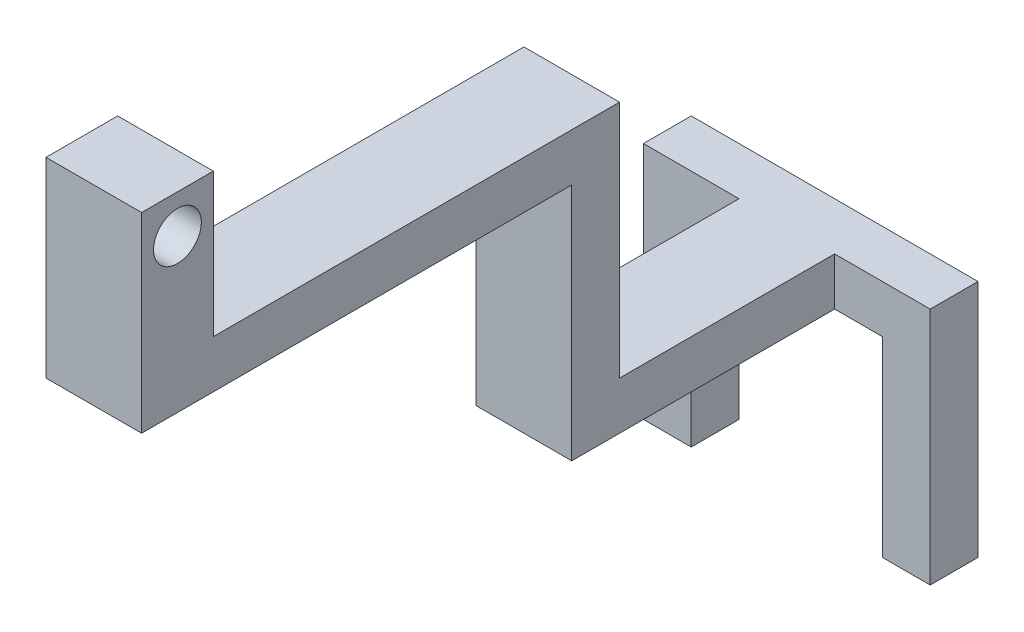
ISO-10303-21;
HEADER;
FILE_DESCRIPTION(('STEP AP214'),'2;1');
FILE_NAME('part.step','',(''),(''),'','','');
FILE_SCHEMA(('AUTOMOTIVE_DESIGN { 1 0 10303 214 1 1 1 1 }'));
ENDSEC;
DATA;
#1=APPLICATION_CONTEXT('core data for automotive mechanical design processes');
#2=APPLICATION_PROTOCOL_DEFINITION('international standard','automotive_design',2000,#1);
#3=PRODUCT_CONTEXT('',#1,'mechanical');
#4=PRODUCT('Part','Part','',(#3));
#5=PRODUCT_RELATED_PRODUCT_CATEGORY('part','',(#4));
#6=PRODUCT_DEFINITION_FORMATION('','',#4);
#7=PRODUCT_DEFINITION_CONTEXT('part definition',#1,'design');
#8=PRODUCT_DEFINITION('design','',#6,#7);
#9=PRODUCT_DEFINITION_SHAPE('','',#8);
#10=(LENGTH_UNIT() NAMED_UNIT(*) SI_UNIT(.MILLI.,.METRE.));
#11=(NAMED_UNIT(*) PLANE_ANGLE_UNIT() SI_UNIT($,.RADIAN.));
#12=(NAMED_UNIT(*) SI_UNIT($,.STERADIAN.) SOLID_ANGLE_UNIT());
#13=UNCERTAINTY_MEASURE_WITH_UNIT(LENGTH_MEASURE(1.E-05),#10,'distance_accuracy_value','');
#14=(GEOMETRIC_REPRESENTATION_CONTEXT(3) GLOBAL_UNCERTAINTY_ASSIGNED_CONTEXT((#13)) GLOBAL_UNIT_ASSIGNED_CONTEXT((#10,
#11,#12)) REPRESENTATION_CONTEXT('',''));
#15=CARTESIAN_POINT('',(0.,0.,0.));
#16=DIRECTION('',(0.,0.,1.));
#17=DIRECTION('',(1.,0.,0.));
#18=AXIS2_PLACEMENT_3D('',#15,#16,#17);
#19=CARTESIAN_POINT('',(0.,50.,0.));
#20=DIRECTION('',(0.,-1.,0.));
#21=DIRECTION('',(0.,0.,-1.));
#22=AXIS2_PLACEMENT_3D('',#19,#20,#21);
#23=PLANE('',#22);
#24=DIRECTION('',(-1.,0.,0.));
#25=VECTOR('',#24,1.);
#26=CARTESIAN_POINT('',(20.,50.,140.));
#27=LINE('',#26,#25);
#28=CARTESIAN_POINT('',(40.,50.,140.));
#29=VERTEX_POINT('',#28);
#30=CARTESIAN_POINT('',(20.,50.,140.));
#31=VERTEX_POINT('',#30);
#32=EDGE_CURVE('E54',#29,#31,#27,.T.);
#33=ORIENTED_EDGE('',*,*,#32,.F.);
#34=DIRECTION('',(0.,0.,-1.));
#35=VECTOR('',#34,1.);
#36=CARTESIAN_POINT('',(40.,50.,65.));
#37=LINE('',#36,#35);
#38=CARTESIAN_POINT('',(40.,50.,55.));
#39=VERTEX_POINT('',#38);
#40=EDGE_CURVE('E214',#29,#39,#37,.T.);
#41=ORIENTED_EDGE('',*,*,#40,.T.);
#42=DIRECTION('',(-1.,0.,0.));
#43=VECTOR('',#42,1.);
#44=CARTESIAN_POINT('',(20.,50.,55.));
#45=LINE('',#44,#43);
#46=CARTESIAN_POINT('',(20.,50.,55.));
#47=VERTEX_POINT('',#46);
#48=EDGE_CURVE('E216',#39,#47,#45,.T.);
#49=ORIENTED_EDGE('',*,*,#48,.T.);
#50=DIRECTION('',(0.,0.,1.));
#51=VECTOR('',#50,1.);
#52=CARTESIAN_POINT('',(20.,50.,65.));
#53=LINE('',#52,#51);
#54=EDGE_CURVE('E212',#47,#31,#53,.T.);
#55=ORIENTED_EDGE('',*,*,#54,.T.);
#56=EDGE_LOOP('',(#33,#41,#49,#55));
#57=FACE_BOUND('',#56,.T.);
#58=ADVANCED_FACE('F39',(#57),#23,.F.);
#59=CARTESIAN_POINT('',(0.,0.,10.));
#60=DIRECTION('',(0.,-1.,0.));
#61=DIRECTION('',(0.,0.,-1.));
#62=AXIS2_PLACEMENT_3D('',#59,#60,#61);
#63=PLANE('',#62);
#64=DIRECTION('',(-1.,0.,0.));
#65=VECTOR('',#64,1.);
#66=CARTESIAN_POINT('',(20.,0.,55.));
#67=LINE('',#66,#65);
#68=CARTESIAN_POINT('',(40.,0.,55.));
#69=VERTEX_POINT('',#68);
#70=CARTESIAN_POINT('',(20.,0.,55.));
#71=VERTEX_POINT('',#70);
#72=EDGE_CURVE('E211',#69,#71,#67,.T.);
#73=ORIENTED_EDGE('',*,*,#72,.F.);
#74=DIRECTION('',(0.,0.,-1.));
#75=VECTOR('',#74,1.);
#76=CARTESIAN_POINT('',(40.,0.,65.));
#77=LINE('',#76,#75);
#78=CARTESIAN_POINT('',(40.,0.,10.));
#79=VERTEX_POINT('',#78);
#80=EDGE_CURVE('E239',#69,#79,#77,.T.);
#81=ORIENTED_EDGE('',*,*,#80,.T.);
#82=DIRECTION('',(-1.,0.,0.));
#83=VECTOR('',#82,1.);
#84=CARTESIAN_POINT('',(0.,0.,10.));
#85=LINE('',#84,#83);
#86=CARTESIAN_POINT('',(60.,0.,10.));
#87=VERTEX_POINT('',#86);
#88=EDGE_CURVE('E266',#87,#79,#85,.T.);
#89=ORIENTED_EDGE('',*,*,#88,.F.);
#90=DIRECTION('',(0.,0.,-1.));
#91=VECTOR('',#90,1.);
#92=CARTESIAN_POINT('',(60.,0.,10.));
#93=LINE('',#92,#91);
#94=CARTESIAN_POINT('',(60.,0.,0.));
#95=VERTEX_POINT('',#94);
#96=EDGE_CURVE('E287',#87,#95,#93,.T.);
#97=ORIENTED_EDGE('',*,*,#96,.T.);
#98=DIRECTION('',(-1.,0.,0.));
#99=VECTOR('',#98,1.);
#100=CARTESIAN_POINT('',(0.,0.,0.));
#101=LINE('',#100,#99);
#102=CARTESIAN_POINT('',(0.,0.,0.));
#103=VERTEX_POINT('',#102);
#104=EDGE_CURVE('E252',#95,#103,#101,.T.);
#105=ORIENTED_EDGE('',*,*,#104,.T.);
#106=DIRECTION('',(0.,0.,-1.));
#107=VECTOR('',#106,1.);
#108=CARTESIAN_POINT('',(0.,0.,10.));
#109=LINE('',#108,#107);
#110=CARTESIAN_POINT('',(0.,0.,10.));
#111=VERTEX_POINT('',#110);
#112=EDGE_CURVE('E269',#111,#103,#109,.T.);
#113=ORIENTED_EDGE('',*,*,#112,.F.);
#114=CARTESIAN_POINT('',(20.,0.,10.));
#115=VERTEX_POINT('',#114);
#116=EDGE_CURVE('E265',#115,#111,#85,.T.);
#117=ORIENTED_EDGE('',*,*,#116,.F.);
#118=DIRECTION('',(0.,0.,-1.));
#119=VECTOR('',#118,1.);
#120=CARTESIAN_POINT('',(20.,0.,65.));
#121=LINE('',#120,#119);
#122=EDGE_CURVE('E234',#71,#115,#121,.T.);
#123=ORIENTED_EDGE('',*,*,#122,.F.);
#124=EDGE_LOOP('',(#73,#81,#89,#97,#105,#113,#117,#123));
#125=FACE_BOUND('',#124,.T.);
#126=ADVANCED_FACE('F348',(#125),#63,.F.);
#127=CARTESIAN_POINT('',(0.,0.,10.));
#128=DIRECTION('',(0.,0.,-1.));
#129=DIRECTION('',(-1.,0.,0.));
#130=AXIS2_PLACEMENT_3D('',#127,#128,#129);
#131=PLANE('',#130);
#132=DIRECTION('',(0.,-1.,0.));
#133=VECTOR('',#132,1.);
#134=CARTESIAN_POINT('',(20.,0.,10.));
#135=LINE('',#134,#133);
#136=CARTESIAN_POINT('',(20.,-10.,10.));
#137=VERTEX_POINT('',#136);
#138=EDGE_CURVE('E226',#115,#137,#135,.T.);
#139=ORIENTED_EDGE('',*,*,#138,.F.);
#140=ORIENTED_EDGE('',*,*,#116,.T.);
#141=DIRECTION('',(0.,-1.,0.));
#142=VECTOR('',#141,1.);
#143=CARTESIAN_POINT('',(0.,-50.,10.));
#144=LINE('',#143,#142);
#145=CARTESIAN_POINT('',(0.,-50.,10.));
#146=VERTEX_POINT('',#145);
#147=EDGE_CURVE('E248',#111,#146,#144,.T.);
#148=ORIENTED_EDGE('',*,*,#147,.T.);
#149=DIRECTION('',(1.,0.,0.));
#150=VECTOR('',#149,1.);
#151=CARTESIAN_POINT('',(10.,-50.,10.));
#152=LINE('',#151,#150);
#153=CARTESIAN_POINT('',(10.,-50.,10.));
#154=VERTEX_POINT('',#153);
#155=EDGE_CURVE('E251',#146,#154,#152,.T.);
#156=ORIENTED_EDGE('',*,*,#155,.T.);
#157=DIRECTION('',(0.,1.,0.));
#158=VECTOR('',#157,1.);
#159=CARTESIAN_POINT('',(10.,-10.,10.));
#160=LINE('',#159,#158);
#161=CARTESIAN_POINT('',(10.,-10.,10.));
#162=VERTEX_POINT('',#161);
#163=EDGE_CURVE('E254',#154,#162,#160,.T.);
#164=ORIENTED_EDGE('',*,*,#163,.T.);
#165=DIRECTION('',(1.,0.,0.));
#166=VECTOR('',#165,1.);
#167=CARTESIAN_POINT('',(50.,-10.,10.));
#168=LINE('',#167,#166);
#169=EDGE_CURVE('E257',#162,#137,#168,.T.);
#170=ORIENTED_EDGE('',*,*,#169,.T.);
#171=EDGE_LOOP('',(#139,#140,#148,#156,#164,#170));
#172=FACE_BOUND('',#171,.T.);
#173=ADVANCED_FACE('F355',(#172),#131,.F.);
#174=DIRECTION('',(0.,1.,0.));
#175=VECTOR('',#174,1.);
#176=CARTESIAN_POINT('',(40.,0.,10.));
#177=LINE('',#176,#175);
#178=CARTESIAN_POINT('',(40.,-10.,10.));
#179=VERTEX_POINT('',#178);
#180=EDGE_CURVE('E230',#179,#79,#177,.T.);
#181=ORIENTED_EDGE('',*,*,#180,.F.);
#182=CARTESIAN_POINT('',(50.,-10.,10.));
#183=VERTEX_POINT('',#182);
#184=EDGE_CURVE('E256',#179,#183,#168,.T.);
#185=ORIENTED_EDGE('',*,*,#184,.T.);
#186=DIRECTION('',(0.,-1.,0.));
#187=VECTOR('',#186,1.);
#188=CARTESIAN_POINT('',(50.,-50.,10.));
#189=LINE('',#188,#187);
#190=CARTESIAN_POINT('',(50.,-50.,10.));
#191=VERTEX_POINT('',#190);
#192=EDGE_CURVE('E259',#183,#191,#189,.T.);
#193=ORIENTED_EDGE('',*,*,#192,.T.);
#194=DIRECTION('',(1.,0.,0.));
#195=VECTOR('',#194,1.);
#196=CARTESIAN_POINT('',(60.,-50.,10.));
#197=LINE('',#196,#195);
#198=CARTESIAN_POINT('',(60.,-50.,10.));
#199=VERTEX_POINT('',#198);
#200=EDGE_CURVE('E261',#191,#199,#197,.T.);
#201=ORIENTED_EDGE('',*,*,#200,.T.);
#202=DIRECTION('',(0.,1.,0.));
#203=VECTOR('',#202,1.);
#204=CARTESIAN_POINT('',(60.,0.,10.));
#205=LINE('',#204,#203);
#206=EDGE_CURVE('E263',#199,#87,#205,.T.);
#207=ORIENTED_EDGE('',*,*,#206,.T.);
#208=ORIENTED_EDGE('',*,*,#88,.T.);
#209=EDGE_LOOP('',(#181,#185,#193,#201,#207,#208));
#210=FACE_BOUND('',#209,.T.);
#211=ADVANCED_FACE('F326',(#210),#131,.F.);
#212=CARTESIAN_POINT('',(0.,-50.,10.));
#213=DIRECTION('',(1.,0.,0.));
#214=DIRECTION('',(0.,0.,-1.));
#215=AXIS2_PLACEMENT_3D('',#212,#213,#214);
#216=PLANE('',#215);
#217=DIRECTION('',(0.,-1.,0.));
#218=VECTOR('',#217,1.);
#219=CARTESIAN_POINT('',(0.,-50.,0.));
#220=LINE('',#219,#218);
#221=CARTESIAN_POINT('',(0.,-50.,0.));
#222=VERTEX_POINT('',#221);
#223=EDGE_CURVE('E247',#103,#222,#220,.T.);
#224=ORIENTED_EDGE('',*,*,#223,.T.);
#225=DIRECTION('',(0.,0.,-1.));
#226=VECTOR('',#225,1.);
#227=CARTESIAN_POINT('',(0.,-50.,10.));
#228=LINE('',#227,#226);
#229=EDGE_CURVE('E11',#146,#222,#228,.T.);
#230=ORIENTED_EDGE('',*,*,#229,.F.);
#231=ORIENTED_EDGE('',*,*,#147,.F.);
#232=ORIENTED_EDGE('',*,*,#112,.T.);
#233=EDGE_LOOP('',(#224,#230,#231,#232));
#234=FACE_BOUND('',#233,.T.);
#235=ADVANCED_FACE('F41',(#234),#216,.F.);
#236=CARTESIAN_POINT('',(10.,-50.,10.));
#237=DIRECTION('',(0.,1.,0.));
#238=DIRECTION('',(0.,0.,1.));
#239=AXIS2_PLACEMENT_3D('',#236,#237,#238);
#240=PLANE('',#239);
#241=DIRECTION('',(1.,0.,0.));
#242=VECTOR('',#241,1.);
#243=CARTESIAN_POINT('',(10.,-50.,0.));
#244=LINE('',#243,#242);
#245=CARTESIAN_POINT('',(10.,-50.,0.));
#246=VERTEX_POINT('',#245);
#247=EDGE_CURVE('E272',#222,#246,#244,.T.);
#248=ORIENTED_EDGE('',*,*,#247,.T.);
#249=DIRECTION('',(0.,0.,-1.));
#250=VECTOR('',#249,1.);
#251=CARTESIAN_POINT('',(10.,-50.,10.));
#252=LINE('',#251,#250);
#253=EDGE_CURVE('E47',#154,#246,#252,.T.);
#254=ORIENTED_EDGE('',*,*,#253,.F.);
#255=ORIENTED_EDGE('',*,*,#155,.F.);
#256=ORIENTED_EDGE('',*,*,#229,.T.);
#257=EDGE_LOOP('',(#248,#254,#255,#256));
#258=FACE_BOUND('',#257,.T.);
#259=ADVANCED_FACE('F358',(#258),#240,.F.);
#260=CARTESIAN_POINT('',(10.,-10.,10.));
#261=DIRECTION('',(-1.,0.,0.));
#262=DIRECTION('',(0.,-1.,0.));
#263=AXIS2_PLACEMENT_3D('',#260,#261,#262);
#264=PLANE('',#263);
#265=DIRECTION('',(0.,1.,0.));
#266=VECTOR('',#265,1.);
#267=CARTESIAN_POINT('',(10.,-10.,0.));
#268=LINE('',#267,#266);
#269=CARTESIAN_POINT('',(10.,-10.,0.));
#270=VERTEX_POINT('',#269);
#271=EDGE_CURVE('E274',#246,#270,#268,.T.);
#272=ORIENTED_EDGE('',*,*,#271,.T.);
#273=DIRECTION('',(0.,0.,-1.));
#274=VECTOR('',#273,1.);
#275=CARTESIAN_POINT('',(10.,-10.,10.));
#276=LINE('',#275,#274);
#277=EDGE_CURVE('E299',#162,#270,#276,.T.);
#278=ORIENTED_EDGE('',*,*,#277,.F.);
#279=ORIENTED_EDGE('',*,*,#163,.F.);
#280=ORIENTED_EDGE('',*,*,#253,.T.);
#281=EDGE_LOOP('',(#272,#278,#279,#280));
#282=FACE_BOUND('',#281,.T.);
#283=ADVANCED_FACE('F306',(#282),#264,.F.);
#284=CARTESIAN_POINT('',(50.,-10.,10.));
#285=DIRECTION('',(0.,1.,0.));
#286=DIRECTION('',(-1.,0.,0.));
#287=AXIS2_PLACEMENT_3D('',#284,#285,#286);
#288=PLANE('',#287);
#289=DIRECTION('',(1.,0.,0.));
#290=VECTOR('',#289,1.);
#291=CARTESIAN_POINT('',(50.,-10.,0.));
#292=LINE('',#291,#290);
#293=CARTESIAN_POINT('',(50.,-10.,0.));
#294=VERTEX_POINT('',#293);
#295=EDGE_CURVE('E276',#270,#294,#292,.T.);
#296=ORIENTED_EDGE('',*,*,#295,.T.);
#297=DIRECTION('',(0.,0.,-1.));
#298=VECTOR('',#297,1.);
#299=CARTESIAN_POINT('',(50.,-10.,10.));
#300=LINE('',#299,#298);
#301=EDGE_CURVE('E296',#183,#294,#300,.T.);
#302=ORIENTED_EDGE('',*,*,#301,.F.);
#303=ORIENTED_EDGE('',*,*,#184,.F.);
#304=DIRECTION('',(0.,0.,-1.));
#305=VECTOR('',#304,1.);
#306=CARTESIAN_POINT('',(40.,-10.,65.));
#307=LINE('',#306,#305);
#308=CARTESIAN_POINT('',(40.,-10.,65.));
#309=VERTEX_POINT('',#308);
#310=EDGE_CURVE('E241',#309,#179,#307,.T.);
#311=ORIENTED_EDGE('',*,*,#310,.F.);
#312=DIRECTION('',(1.,0.,0.));
#313=VECTOR('',#312,1.);
#314=CARTESIAN_POINT('',(20.,-10.,65.));
#315=LINE('',#314,#313);
#316=CARTESIAN_POINT('',(20.,-10.,65.));
#317=VERTEX_POINT('',#316);
#318=EDGE_CURVE('E229',#317,#309,#315,.T.);
#319=ORIENTED_EDGE('',*,*,#318,.F.);
#320=DIRECTION('',(0.,0.,-1.));
#321=VECTOR('',#320,1.);
#322=CARTESIAN_POINT('',(20.,-10.,65.));
#323=LINE('',#322,#321);
#324=EDGE_CURVE('E244',#317,#137,#323,.T.);
#325=ORIENTED_EDGE('',*,*,#324,.T.);
#326=ORIENTED_EDGE('',*,*,#169,.F.);
#327=ORIENTED_EDGE('',*,*,#277,.T.);
#328=EDGE_LOOP('',(#296,#302,#303,#311,#319,#325,#326,#327));
#329=FACE_BOUND('',#328,.T.);
#330=ADVANCED_FACE('F317',(#329),#288,.F.);
#331=CARTESIAN_POINT('',(50.,-50.,10.));
#332=DIRECTION('',(1.,0.,0.));
#333=DIRECTION('',(0.,0.,-1.));
#334=AXIS2_PLACEMENT_3D('',#331,#332,#333);
#335=PLANE('',#334);
#336=DIRECTION('',(0.,-1.,0.));
#337=VECTOR('',#336,1.);
#338=CARTESIAN_POINT('',(50.,-50.,0.));
#339=LINE('',#338,#337);
#340=CARTESIAN_POINT('',(50.,-50.,0.));
#341=VERTEX_POINT('',#340);
#342=EDGE_CURVE('E278',#294,#341,#339,.T.);
#343=ORIENTED_EDGE('',*,*,#342,.T.);
#344=DIRECTION('',(0.,0.,-1.));
#345=VECTOR('',#344,1.);
#346=CARTESIAN_POINT('',(50.,-50.,10.));
#347=LINE('',#346,#345);
#348=EDGE_CURVE('E293',#191,#341,#347,.T.);
#349=ORIENTED_EDGE('',*,*,#348,.F.);
#350=ORIENTED_EDGE('',*,*,#192,.F.);
#351=ORIENTED_EDGE('',*,*,#301,.T.);
#352=EDGE_LOOP('',(#343,#349,#350,#351));
#353=FACE_BOUND('',#352,.T.);
#354=ADVANCED_FACE('F322',(#353),#335,.F.);
#355=CARTESIAN_POINT('',(60.,-50.,10.));
#356=DIRECTION('',(0.,1.,0.));
#357=DIRECTION('',(0.,0.,1.));
#358=AXIS2_PLACEMENT_3D('',#355,#356,#357);
#359=PLANE('',#358);
#360=DIRECTION('',(1.,0.,0.));
#361=VECTOR('',#360,1.);
#362=CARTESIAN_POINT('',(60.,-50.,0.));
#363=LINE('',#362,#361);
#364=CARTESIAN_POINT('',(60.,-50.,0.));
#365=VERTEX_POINT('',#364);
#366=EDGE_CURVE('E280',#341,#365,#363,.T.);
#367=ORIENTED_EDGE('',*,*,#366,.T.);
#368=DIRECTION('',(0.,0.,-1.));
#369=VECTOR('',#368,1.);
#370=CARTESIAN_POINT('',(60.,-50.,10.));
#371=LINE('',#370,#369);
#372=EDGE_CURVE('E290',#199,#365,#371,.T.);
#373=ORIENTED_EDGE('',*,*,#372,.F.);
#374=ORIENTED_EDGE('',*,*,#200,.F.);
#375=ORIENTED_EDGE('',*,*,#348,.T.);
#376=EDGE_LOOP('',(#367,#373,#374,#375));
#377=FACE_BOUND('',#376,.T.);
#378=ADVANCED_FACE('F367',(#377),#359,.F.);
#379=CARTESIAN_POINT('',(60.,0.,10.));
#380=DIRECTION('',(-1.,0.,0.));
#381=DIRECTION('',(0.,-1.,0.));
#382=AXIS2_PLACEMENT_3D('',#379,#380,#381);
#383=PLANE('',#382);
#384=DIRECTION('',(0.,1.,0.));
#385=VECTOR('',#384,1.);
#386=CARTESIAN_POINT('',(60.,0.,0.));
#387=LINE('',#386,#385);
#388=EDGE_CURVE('E282',#365,#95,#387,.T.);
#389=ORIENTED_EDGE('',*,*,#388,.T.);
#390=ORIENTED_EDGE('',*,*,#96,.F.);
#391=ORIENTED_EDGE('',*,*,#206,.F.);
#392=ORIENTED_EDGE('',*,*,#372,.T.);
#393=EDGE_LOOP('',(#389,#390,#391,#392));
#394=FACE_BOUND('',#393,.T.);
#395=ADVANCED_FACE('F365',(#394),#383,.F.);
#396=CARTESIAN_POINT('',(0.,0.,0.));
#397=DIRECTION('',(0.,0.,-1.));
#398=DIRECTION('',(-1.,0.,0.));
#399=AXIS2_PLACEMENT_3D('',#396,#397,#398);
#400=PLANE('',#399);
#401=ORIENTED_EDGE('',*,*,#223,.F.);
#402=ORIENTED_EDGE('',*,*,#104,.F.);
#403=ORIENTED_EDGE('',*,*,#388,.F.);
#404=ORIENTED_EDGE('',*,*,#366,.F.);
#405=ORIENTED_EDGE('',*,*,#342,.F.);
#406=ORIENTED_EDGE('',*,*,#295,.F.);
#407=ORIENTED_EDGE('',*,*,#271,.F.);
#408=ORIENTED_EDGE('',*,*,#247,.F.);
#409=EDGE_LOOP('',(#401,#402,#403,#404,#405,#406,#407,#408));
#410=FACE_BOUND('',#409,.T.);
#411=ADVANCED_FACE('F312',(#410),#400,.T.);
#412=CARTESIAN_POINT('',(20.,0.,65.));
#413=DIRECTION('',(1.,0.,0.));
#414=DIRECTION('',(0.,1.,0.));
#415=AXIS2_PLACEMENT_3D('',#412,#413,#414);
#416=PLANE('',#415);
#417=CARTESIAN_POINT('',(20.,72.,147.5));
#418=DIRECTION('',(1.,0.,0.));
#419=DIRECTION('',(0.,0.,-1.));
#420=AXIS2_PLACEMENT_3D('',#417,#418,#419);
#421=CIRCLE('',#420,4.99999999999999);
#422=CARTESIAN_POINT('',(20.,72.,142.5));
#423=VERTEX_POINT('',#422);
#424=EDGE_CURVE('E191',#423,#423,#421,.T.);
#425=ORIENTED_EDGE('',*,*,#424,.T.);
#426=EDGE_LOOP('',(#425));
#427=FACE_BOUND('',#426,.T.);
#428=ORIENTED_EDGE('',*,*,#138,.T.);
#429=ORIENTED_EDGE('',*,*,#324,.F.);
#430=DIRECTION('',(0.,-1.,0.));
#431=VECTOR('',#430,1.);
#432=CARTESIAN_POINT('',(20.,0.,65.));
#433=LINE('',#432,#431);
#434=CARTESIAN_POINT('',(20.,40.,65.));
#435=VERTEX_POINT('',#434);
#436=EDGE_CURVE('E227',#435,#317,#433,.T.);
#437=ORIENTED_EDGE('',*,*,#436,.F.);
#438=DIRECTION('',(0.,0.,-1.));
#439=VECTOR('',#438,1.);
#440=CARTESIAN_POINT('',(20.,40.,155.));
#441=LINE('',#440,#439);
#442=CARTESIAN_POINT('',(20.,40.,155.));
#443=VERTEX_POINT('',#442);
#444=EDGE_CURVE('E173',#443,#435,#441,.T.);
#445=ORIENTED_EDGE('',*,*,#444,.F.);
#446=DIRECTION('',(0.,-1.,0.));
#447=VECTOR('',#446,1.);
#448=CARTESIAN_POINT('',(20.,50.,155.));
#449=LINE('',#448,#447);
#450=CARTESIAN_POINT('',(20.,80.,155.));
#451=VERTEX_POINT('',#450);
#452=EDGE_CURVE('E165',#451,#443,#449,.T.);
#453=ORIENTED_EDGE('',*,*,#452,.F.);
#454=DIRECTION('',(0.,0.,1.));
#455=VECTOR('',#454,1.);
#456=CARTESIAN_POINT('',(20.,80.,155.));
#457=LINE('',#456,#455);
#458=CARTESIAN_POINT('',(20.,80.,140.));
#459=VERTEX_POINT('',#458);
#460=EDGE_CURVE('E171',#459,#451,#457,.T.);
#461=ORIENTED_EDGE('',*,*,#460,.F.);
#462=DIRECTION('',(0.,-1.,0.));
#463=VECTOR('',#462,1.);
#464=CARTESIAN_POINT('',(20.,80.,140.));
#465=LINE('',#464,#463);
#466=EDGE_CURVE('E198',#459,#31,#465,.T.);
#467=ORIENTED_EDGE('',*,*,#466,.T.);
#468=ORIENTED_EDGE('',*,*,#54,.F.);
#469=DIRECTION('',(0.,-1.,0.));
#470=VECTOR('',#469,1.);
#471=CARTESIAN_POINT('',(20.,50.,55.));
#472=LINE('',#471,#470);
#473=EDGE_CURVE('E218',#47,#71,#472,.T.);
#474=ORIENTED_EDGE('',*,*,#473,.T.);
#475=ORIENTED_EDGE('',*,*,#122,.T.);
#476=EDGE_LOOP('',(#428,#429,#437,#445,#453,#461,#467,#468,#474,#475));
#477=FACE_BOUND('',#476,.T.);
#478=ADVANCED_FACE('F168',(#427,#477),#416,.F.);
#479=CARTESIAN_POINT('',(40.,0.,65.));
#480=DIRECTION('',(-1.,0.,0.));
#481=DIRECTION('',(0.,0.,1.));
#482=AXIS2_PLACEMENT_3D('',#479,#480,#481);
#483=PLANE('',#482);
#484=CARTESIAN_POINT('',(40.,72.,147.5));
#485=DIRECTION('',(1.,0.,0.));
#486=DIRECTION('',(0.,0.,-1.));
#487=AXIS2_PLACEMENT_3D('',#484,#485,#486);
#488=CIRCLE('',#487,4.99999999999999);
#489=CARTESIAN_POINT('',(40.,72.,142.5));
#490=VERTEX_POINT('',#489);
#491=EDGE_CURVE('E194',#490,#490,#488,.T.);
#492=ORIENTED_EDGE('',*,*,#491,.F.);
#493=EDGE_LOOP('',(#492));
#494=FACE_BOUND('',#493,.T.);
#495=ORIENTED_EDGE('',*,*,#180,.T.);
#496=ORIENTED_EDGE('',*,*,#80,.F.);
#497=DIRECTION('',(0.,-1.,0.));
#498=VECTOR('',#497,1.);
#499=CARTESIAN_POINT('',(40.,50.,55.));
#500=LINE('',#499,#498);
#501=EDGE_CURVE('E223',#39,#69,#500,.T.);
#502=ORIENTED_EDGE('',*,*,#501,.F.);
#503=ORIENTED_EDGE('',*,*,#40,.F.);
#504=DIRECTION('',(0.,-1.,0.));
#505=VECTOR('',#504,1.);
#506=CARTESIAN_POINT('',(40.,80.,140.));
#507=LINE('',#506,#505);
#508=CARTESIAN_POINT('',(40.,80.,140.));
#509=VERTEX_POINT('',#508);
#510=EDGE_CURVE('E201',#509,#29,#507,.T.);
#511=ORIENTED_EDGE('',*,*,#510,.F.);
#512=DIRECTION('',(0.,0.,-1.));
#513=VECTOR('',#512,1.);
#514=CARTESIAN_POINT('',(40.,80.,155.));
#515=LINE('',#514,#513);
#516=CARTESIAN_POINT('',(40.,80.,155.));
#517=VERTEX_POINT('',#516);
#518=EDGE_CURVE('E184',#517,#509,#515,.T.);
#519=ORIENTED_EDGE('',*,*,#518,.F.);
#520=DIRECTION('',(0.,1.,0.));
#521=VECTOR('',#520,1.);
#522=CARTESIAN_POINT('',(40.,50.,155.));
#523=LINE('',#522,#521);
#524=CARTESIAN_POINT('',(40.,40.,155.));
#525=VERTEX_POINT('',#524);
#526=EDGE_CURVE('E181',#525,#517,#523,.T.);
#527=ORIENTED_EDGE('',*,*,#526,.F.);
#528=DIRECTION('',(0.,0.,-1.));
#529=VECTOR('',#528,1.);
#530=CARTESIAN_POINT('',(40.,40.,155.));
#531=LINE('',#530,#529);
#532=CARTESIAN_POINT('',(40.,40.,65.));
#533=VERTEX_POINT('',#532);
#534=EDGE_CURVE('E206',#525,#533,#531,.T.);
#535=ORIENTED_EDGE('',*,*,#534,.T.);
#536=DIRECTION('',(0.,1.,0.));
#537=VECTOR('',#536,1.);
#538=CARTESIAN_POINT('',(40.,0.,65.));
#539=LINE('',#538,#537);
#540=EDGE_CURVE('E232',#309,#533,#539,.T.);
#541=ORIENTED_EDGE('',*,*,#540,.F.);
#542=ORIENTED_EDGE('',*,*,#310,.T.);
#543=EDGE_LOOP('',(#495,#496,#502,#503,#511,#519,#527,#535,#541,#542));
#544=FACE_BOUND('',#543,.T.);
#545=ADVANCED_FACE('F332',(#494,#544),#483,.F.);
#546=CARTESIAN_POINT('',(0.,0.,65.));
#547=DIRECTION('',(0.,0.,1.));
#548=DIRECTION('',(1.,0.,0.));
#549=AXIS2_PLACEMENT_3D('',#546,#547,#548);
#550=PLANE('',#549);
#551=DIRECTION('',(1.,0.,0.));
#552=VECTOR('',#551,1.);
#553=CARTESIAN_POINT('',(20.,40.,65.));
#554=LINE('',#553,#552);
#555=EDGE_CURVE('E62',#435,#533,#554,.T.);
#556=ORIENTED_EDGE('',*,*,#555,.F.);
#557=ORIENTED_EDGE('',*,*,#436,.T.);
#558=ORIENTED_EDGE('',*,*,#318,.T.);
#559=ORIENTED_EDGE('',*,*,#540,.T.);
#560=EDGE_LOOP('',(#556,#557,#558,#559));
#561=FACE_BOUND('',#560,.T.);
#562=ADVANCED_FACE('F335',(#561),#550,.T.);
#563=CARTESIAN_POINT('',(20.,50.,55.));
#564=DIRECTION('',(0.,0.,1.));
#565=DIRECTION('',(1.,0.,0.));
#566=AXIS2_PLACEMENT_3D('',#563,#564,#565);
#567=PLANE('',#566);
#568=ORIENTED_EDGE('',*,*,#72,.T.);
#569=ORIENTED_EDGE('',*,*,#473,.F.);
#570=ORIENTED_EDGE('',*,*,#48,.F.);
#571=ORIENTED_EDGE('',*,*,#501,.T.);
#572=EDGE_LOOP('',(#568,#569,#570,#571));
#573=FACE_BOUND('',#572,.T.);
#574=ADVANCED_FACE('F346',(#573),#567,.F.);
#575=CARTESIAN_POINT('',(20.,40.,155.));
#576=DIRECTION('',(0.,1.,0.));
#577=DIRECTION('',(0.,0.,1.));
#578=AXIS2_PLACEMENT_3D('',#575,#576,#577);
#579=PLANE('',#578);
#580=ORIENTED_EDGE('',*,*,#555,.T.);
#581=ORIENTED_EDGE('',*,*,#534,.F.);
#582=DIRECTION('',(1.,0.,0.));
#583=VECTOR('',#582,1.);
#584=CARTESIAN_POINT('',(20.,40.,155.));
#585=LINE('',#584,#583);
#586=EDGE_CURVE('E175',#443,#525,#585,.T.);
#587=ORIENTED_EDGE('',*,*,#586,.F.);
#588=ORIENTED_EDGE('',*,*,#444,.T.);
#589=EDGE_LOOP('',(#580,#581,#587,#588));
#590=FACE_BOUND('',#589,.T.);
#591=ADVANCED_FACE('F337',(#590),#579,.F.);
#592=CARTESIAN_POINT('',(0.,0.,155.));
#593=DIRECTION('',(0.,0.,1.));
#594=DIRECTION('',(1.,0.,0.));
#595=AXIS2_PLACEMENT_3D('',#592,#593,#594);
#596=PLANE('',#595);
#597=ORIENTED_EDGE('',*,*,#452,.T.);
#598=ORIENTED_EDGE('',*,*,#586,.T.);
#599=ORIENTED_EDGE('',*,*,#526,.T.);
#600=DIRECTION('',(1.,0.,0.));
#601=VECTOR('',#600,1.);
#602=CARTESIAN_POINT('',(20.,80.,155.));
#603=LINE('',#602,#601);
#604=EDGE_CURVE('E178',#451,#517,#603,.T.);
#605=ORIENTED_EDGE('',*,*,#604,.F.);
#606=EDGE_LOOP('',(#597,#598,#599,#605));
#607=FACE_BOUND('',#606,.T.);
#608=ADVANCED_FACE('F179',(#607),#596,.T.);
#609=CARTESIAN_POINT('',(20.,80.,140.));
#610=DIRECTION('',(0.,0.,1.));
#611=DIRECTION('',(1.,0.,0.));
#612=AXIS2_PLACEMENT_3D('',#609,#610,#611);
#613=PLANE('',#612);
#614=ORIENTED_EDGE('',*,*,#32,.T.);
#615=ORIENTED_EDGE('',*,*,#466,.F.);
#616=DIRECTION('',(-1.,0.,0.));
#617=VECTOR('',#616,1.);
#618=CARTESIAN_POINT('',(20.,80.,140.));
#619=LINE('',#618,#617);
#620=EDGE_CURVE('E188',#509,#459,#619,.T.);
#621=ORIENTED_EDGE('',*,*,#620,.F.);
#622=ORIENTED_EDGE('',*,*,#510,.T.);
#623=EDGE_LOOP('',(#614,#615,#621,#622));
#624=FACE_BOUND('',#623,.T.);
#625=ADVANCED_FACE('F341',(#624),#613,.F.);
#626=CARTESIAN_POINT('',(0.,80.,0.));
#627=DIRECTION('',(0.,-1.,0.));
#628=DIRECTION('',(0.,0.,-1.));
#629=AXIS2_PLACEMENT_3D('',#626,#627,#628);
#630=PLANE('',#629);
#631=ORIENTED_EDGE('',*,*,#460,.T.);
#632=ORIENTED_EDGE('',*,*,#604,.T.);
#633=ORIENTED_EDGE('',*,*,#518,.T.);
#634=ORIENTED_EDGE('',*,*,#620,.T.);
#635=EDGE_LOOP('',(#631,#632,#633,#634));
#636=FACE_BOUND('',#635,.T.);
#637=ADVANCED_FACE('F186',(#636),#630,.F.);
#638=CARTESIAN_POINT('',(20.,72.,147.5));
#639=DIRECTION('',(1.,0.,0.));
#640=DIRECTION('',(0.,0.,-1.));
#641=AXIS2_PLACEMENT_3D('',#638,#639,#640);
#642=CYLINDRICAL_SURFACE('',#641,4.99999999999999);
#643=ORIENTED_EDGE('',*,*,#424,.F.);
#644=EDGE_LOOP('',(#643));
#645=FACE_BOUND('',#644,.T.);
#646=ORIENTED_EDGE('',*,*,#491,.T.);
#647=EDGE_LOOP('',(#646));
#648=FACE_BOUND('',#647,.T.);
#649=ADVANCED_FACE('F481',(#645,#648),#642,.F.);
#650=CLOSED_SHELL('',(#58,#126,#173,#211,#235,#259,#283,#330,#354,#378,#395,#411,#478,#545,#562,
#574,#591,#608,#625,#637,#649));
#651=MANIFOLD_SOLID_BREP('B2',#650);
#652=ADVANCED_BREP_SHAPE_REPRESENTATION('',(#18,#651),#14);
#653=SHAPE_DEFINITION_REPRESENTATION(#9,#652);
ENDSEC;
END-ISO-10303-21;
